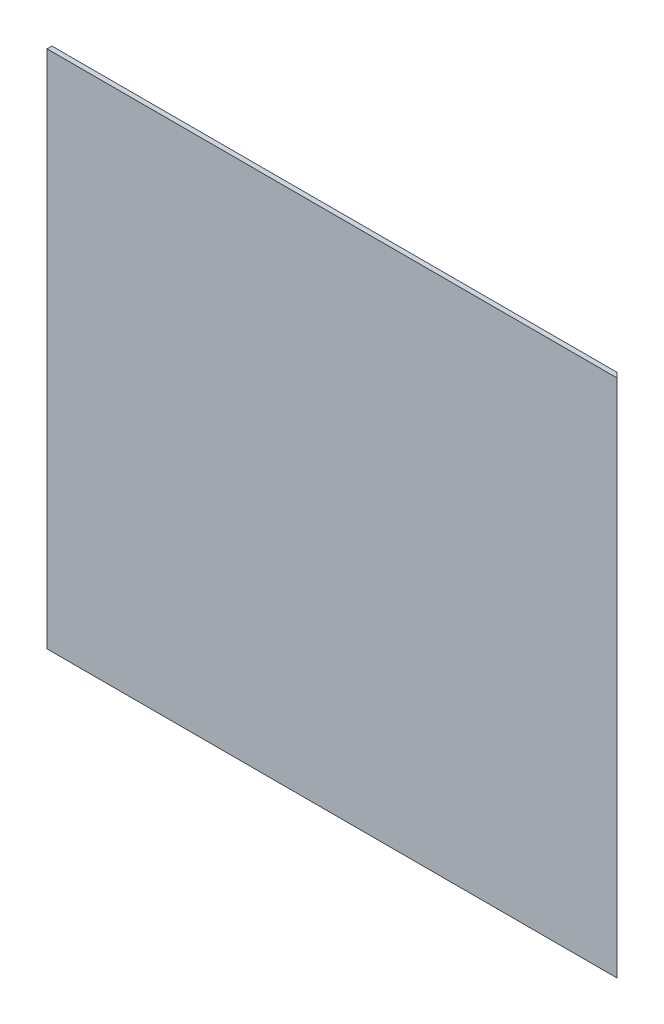
ISO-10303-21;
HEADER;
FILE_DESCRIPTION(('STEP AP214'),'2;1');
FILE_NAME('part.step','',(''),(''),'','','');
FILE_SCHEMA(('AUTOMOTIVE_DESIGN { 1 0 10303 214 1 1 1 1 }'));
ENDSEC;
DATA;
#1=APPLICATION_CONTEXT('core data for automotive mechanical design processes');
#2=APPLICATION_PROTOCOL_DEFINITION('international standard','automotive_design',2000,#1);
#3=PRODUCT_CONTEXT('',#1,'mechanical');
#4=PRODUCT('Part','Part','',(#3));
#5=PRODUCT_RELATED_PRODUCT_CATEGORY('part','',(#4));
#6=PRODUCT_DEFINITION_FORMATION('','',#4);
#7=PRODUCT_DEFINITION_CONTEXT('part definition',#1,'design');
#8=PRODUCT_DEFINITION('design','',#6,#7);
#9=PRODUCT_DEFINITION_SHAPE('','',#8);
#10=(LENGTH_UNIT() NAMED_UNIT(*) SI_UNIT(.MILLI.,.METRE.));
#11=(NAMED_UNIT(*) PLANE_ANGLE_UNIT() SI_UNIT($,.RADIAN.));
#12=(NAMED_UNIT(*) SI_UNIT($,.STERADIAN.) SOLID_ANGLE_UNIT());
#13=UNCERTAINTY_MEASURE_WITH_UNIT(LENGTH_MEASURE(1.E-05),#10,'distance_accuracy_value','');
#14=(GEOMETRIC_REPRESENTATION_CONTEXT(3) GLOBAL_UNCERTAINTY_ASSIGNED_CONTEXT((#13)) GLOBAL_UNIT_ASSIGNED_CONTEXT((#10,
#11,#12)) REPRESENTATION_CONTEXT('',''));
#15=CARTESIAN_POINT('',(0.,0.,0.));
#16=DIRECTION('',(0.,0.,1.));
#17=DIRECTION('',(1.,0.,0.));
#18=AXIS2_PLACEMENT_3D('',#15,#16,#17);
#19=CARTESIAN_POINT('',(-175.5,160.,3.));
#20=DIRECTION('',(0.,-1.,0.));
#21=DIRECTION('',(0.,0.,-1.));
#22=AXIS2_PLACEMENT_3D('',#19,#20,#21);
#23=PLANE('',#22);
#24=DIRECTION('',(-1.,0.,0.));
#25=VECTOR('',#24,1.);
#26=CARTESIAN_POINT('',(-175.5,160.,3.));
#27=LINE('',#26,#25);
#28=CARTESIAN_POINT('',(175.5,160.,3.));
#29=VERTEX_POINT('',#28);
#30=CARTESIAN_POINT('',(-175.5,160.,3.));
#31=VERTEX_POINT('',#30);
#32=EDGE_CURVE('E89',#29,#31,#27,.T.);
#33=ORIENTED_EDGE('',*,*,#32,.F.);
#34=DIRECTION('',(0.707106781186551,0.,0.707106781186544));
#35=VECTOR('',#34,1.);
#36=CARTESIAN_POINT('',(175.5,160.,3.));
#37=LINE('',#36,#35);
#38=CARTESIAN_POINT('',(172.5,160.,0.));
#39=VERTEX_POINT('',#38);
#40=EDGE_CURVE('E97',#39,#29,#37,.T.);
#41=ORIENTED_EDGE('',*,*,#40,.F.);
#42=DIRECTION('',(-1.,0.,0.));
#43=VECTOR('',#42,1.);
#44=CARTESIAN_POINT('',(-175.5,160.,0.));
#45=LINE('',#44,#43);
#46=CARTESIAN_POINT('',(-175.5,160.,0.));
#47=VERTEX_POINT('',#46);
#48=EDGE_CURVE('E78',#39,#47,#45,.T.);
#49=ORIENTED_EDGE('',*,*,#48,.T.);
#50=DIRECTION('',(0.,0.,-1.));
#51=VECTOR('',#50,1.);
#52=CARTESIAN_POINT('',(-175.5,160.,3.));
#53=LINE('',#52,#51);
#54=EDGE_CURVE('E11',#31,#47,#53,.T.);
#55=ORIENTED_EDGE('',*,*,#54,.F.);
#56=EDGE_LOOP('',(#33,#41,#49,#55));
#57=FACE_BOUND('',#56,.T.);
#58=ADVANCED_FACE('F34',(#57),#23,.F.);
#59=CARTESIAN_POINT('',(-175.5,160.,3.));
#60=DIRECTION('',(1.,0.,0.));
#61=DIRECTION('',(0.,1.,0.));
#62=AXIS2_PLACEMENT_3D('',#59,#60,#61);
#63=PLANE('',#62);
#64=DIRECTION('',(0.,-1.,0.));
#65=VECTOR('',#64,1.);
#66=CARTESIAN_POINT('',(-175.5,160.,0.));
#67=LINE('',#66,#65);
#68=CARTESIAN_POINT('',(-175.5,-160.,0.));
#69=VERTEX_POINT('',#68);
#70=EDGE_CURVE('E69',#47,#69,#67,.T.);
#71=ORIENTED_EDGE('',*,*,#70,.T.);
#72=DIRECTION('',(0.,0.,-1.));
#73=VECTOR('',#72,1.);
#74=CARTESIAN_POINT('',(-175.5,-160.,3.));
#75=LINE('',#74,#73);
#76=CARTESIAN_POINT('',(-175.5,-160.,3.));
#77=VERTEX_POINT('',#76);
#78=EDGE_CURVE('E41',#77,#69,#75,.T.);
#79=ORIENTED_EDGE('',*,*,#78,.F.);
#80=DIRECTION('',(0.,-1.,0.));
#81=VECTOR('',#80,1.);
#82=CARTESIAN_POINT('',(-175.5,160.,3.));
#83=LINE('',#82,#81);
#84=EDGE_CURVE('E57',#31,#77,#83,.T.);
#85=ORIENTED_EDGE('',*,*,#84,.F.);
#86=ORIENTED_EDGE('',*,*,#54,.T.);
#87=EDGE_LOOP('',(#71,#79,#85,#86));
#88=FACE_BOUND('',#87,.T.);
#89=ADVANCED_FACE('F71',(#88),#63,.F.);
#90=CARTESIAN_POINT('',(-175.5,-160.,3.));
#91=DIRECTION('',(0.,1.,0.));
#92=DIRECTION('',(0.,0.,1.));
#93=AXIS2_PLACEMENT_3D('',#90,#91,#92);
#94=PLANE('',#93);
#95=DIRECTION('',(1.,0.,0.));
#96=VECTOR('',#95,1.);
#97=CARTESIAN_POINT('',(-175.5,-160.,0.));
#98=LINE('',#97,#96);
#99=CARTESIAN_POINT('',(172.5,-160.,0.));
#100=VERTEX_POINT('',#99);
#101=EDGE_CURVE('E77',#69,#100,#98,.T.);
#102=ORIENTED_EDGE('',*,*,#101,.T.);
#103=DIRECTION('',(0.707106781186551,0.,0.707106781186544));
#104=VECTOR('',#103,1.);
#105=CARTESIAN_POINT('',(175.5,-160.,3.));
#106=LINE('',#105,#104);
#107=CARTESIAN_POINT('',(175.5,-160.,3.));
#108=VERTEX_POINT('',#107);
#109=EDGE_CURVE('E48',#100,#108,#106,.T.);
#110=ORIENTED_EDGE('',*,*,#109,.T.);
#111=DIRECTION('',(1.,0.,0.));
#112=VECTOR('',#111,1.);
#113=CARTESIAN_POINT('',(-175.5,-160.,3.));
#114=LINE('',#113,#112);
#115=EDGE_CURVE('E83',#77,#108,#114,.T.);
#116=ORIENTED_EDGE('',*,*,#115,.F.);
#117=ORIENTED_EDGE('',*,*,#78,.T.);
#118=EDGE_LOOP('',(#102,#110,#116,#117));
#119=FACE_BOUND('',#118,.T.);
#120=ADVANCED_FACE('F82',(#119),#94,.F.);
#121=CARTESIAN_POINT('',(0.,0.,3.));
#122=DIRECTION('',(0.,0.,1.));
#123=DIRECTION('',(1.,0.,0.));
#124=AXIS2_PLACEMENT_3D('',#121,#122,#123);
#125=PLANE('',#124);
#126=DIRECTION('',(0.,1.,0.));
#127=VECTOR('',#126,1.);
#128=CARTESIAN_POINT('',(175.5,160.,3.));
#129=LINE('',#128,#127);
#130=EDGE_CURVE('E86',#108,#29,#129,.T.);
#131=ORIENTED_EDGE('',*,*,#130,.T.);
#132=ORIENTED_EDGE('',*,*,#32,.T.);
#133=ORIENTED_EDGE('',*,*,#84,.T.);
#134=ORIENTED_EDGE('',*,*,#115,.T.);
#135=EDGE_LOOP('',(#131,#132,#133,#134));
#136=FACE_BOUND('',#135,.T.);
#137=ADVANCED_FACE('F102',(#136),#125,.T.);
#138=CARTESIAN_POINT('',(0.,0.,0.));
#139=DIRECTION('',(0.,0.,1.));
#140=DIRECTION('',(1.,0.,0.));
#141=AXIS2_PLACEMENT_3D('',#138,#139,#140);
#142=PLANE('',#141);
#143=ORIENTED_EDGE('',*,*,#48,.F.);
#144=DIRECTION('',(0.,1.,0.));
#145=VECTOR('',#144,1.);
#146=CARTESIAN_POINT('',(172.5,-160.,0.));
#147=LINE('',#146,#145);
#148=EDGE_CURVE('E85',#100,#39,#147,.T.);
#149=ORIENTED_EDGE('',*,*,#148,.F.);
#150=ORIENTED_EDGE('',*,*,#101,.F.);
#151=ORIENTED_EDGE('',*,*,#70,.F.);
#152=EDGE_LOOP('',(#143,#149,#150,#151));
#153=FACE_BOUND('',#152,.T.);
#154=ADVANCED_FACE('F84',(#153),#142,.F.);
#155=CARTESIAN_POINT('',(175.5,-160.,3.));
#156=DIRECTION('',(-0.707106781186544,0.,0.707106781186551));
#157=DIRECTION('',(0.707106781186551,0.,0.707106781186544));
#158=AXIS2_PLACEMENT_3D('',#155,#156,#157);
#159=PLANE('',#158);
#160=ORIENTED_EDGE('',*,*,#40,.T.);
#161=ORIENTED_EDGE('',*,*,#130,.F.);
#162=ORIENTED_EDGE('',*,*,#109,.F.);
#163=ORIENTED_EDGE('',*,*,#148,.T.);
#164=EDGE_LOOP('',(#160,#161,#162,#163));
#165=FACE_BOUND('',#164,.T.);
#166=ADVANCED_FACE('F105',(#165),#159,.F.);
#167=CLOSED_SHELL('',(#58,#89,#120,#137,#154,#166));
#168=MANIFOLD_SOLID_BREP('B2',#167);
#169=ADVANCED_BREP_SHAPE_REPRESENTATION('',(#18,#168),#14);
#170=SHAPE_DEFINITION_REPRESENTATION(#9,#169);
ENDSEC;
END-ISO-10303-21;
